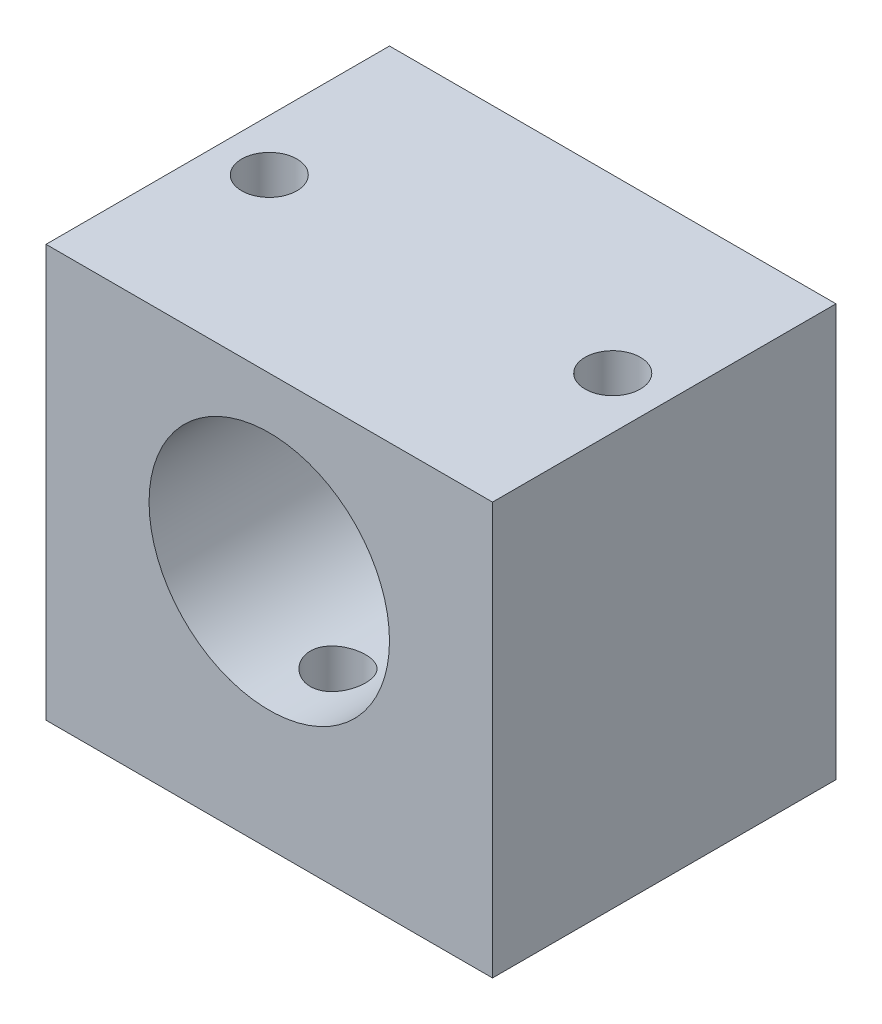
ISO-10303-21;
HEADER;
FILE_DESCRIPTION(('STEP AP214'),'2;1');
FILE_NAME('part.step','',(''),(''),'','','');
FILE_SCHEMA(('AUTOMOTIVE_DESIGN { 1 0 10303 214 1 1 1 1 }'));
ENDSEC;
DATA;
#1=APPLICATION_CONTEXT('core data for automotive mechanical design processes');
#2=APPLICATION_PROTOCOL_DEFINITION('international standard','automotive_design',2000,#1);
#3=PRODUCT_CONTEXT('',#1,'mechanical');
#4=PRODUCT('Part','Part','',(#3));
#5=PRODUCT_RELATED_PRODUCT_CATEGORY('part','',(#4));
#6=PRODUCT_DEFINITION_FORMATION('','',#4);
#7=PRODUCT_DEFINITION_CONTEXT('part definition',#1,'design');
#8=PRODUCT_DEFINITION('design','',#6,#7);
#9=PRODUCT_DEFINITION_SHAPE('','',#8);
#10=(LENGTH_UNIT() NAMED_UNIT(*) SI_UNIT(.MILLI.,.METRE.));
#11=(NAMED_UNIT(*) PLANE_ANGLE_UNIT() SI_UNIT($,.RADIAN.));
#12=(NAMED_UNIT(*) SI_UNIT($,.STERADIAN.) SOLID_ANGLE_UNIT());
#13=UNCERTAINTY_MEASURE_WITH_UNIT(LENGTH_MEASURE(1.E-05),#10,'distance_accuracy_value','');
#14=(GEOMETRIC_REPRESENTATION_CONTEXT(3) GLOBAL_UNCERTAINTY_ASSIGNED_CONTEXT((#13)) GLOBAL_UNIT_ASSIGNED_CONTEXT((#10,
#11,#12)) REPRESENTATION_CONTEXT('',''));
#15=CARTESIAN_POINT('',(0.,0.,0.));
#16=DIRECTION('',(0.,0.,1.));
#17=DIRECTION('',(1.,0.,0.));
#18=AXIS2_PLACEMENT_3D('',#15,#16,#17);
#19=CARTESIAN_POINT('',(20.6375,19.05,-15.875));
#20=DIRECTION('',(0.,0.,1.));
#21=DIRECTION('',(0.,-1.,0.));
#22=AXIS2_PLACEMENT_3D('',#19,#20,#21);
#23=PLANE('',#22);
#24=CARTESIAN_POINT('',(0.,3.175,-15.875));
#25=DIRECTION('',(0.,0.,1.));
#26=DIRECTION('',(0.,-1.,0.));
#27=AXIS2_PLACEMENT_3D('',#24,#25,#26);
#28=CIRCLE('',#27,11.1125);
#29=CARTESIAN_POINT('',(0.,-7.93750000000001,-15.875));
#30=VERTEX_POINT('',#29);
#31=EDGE_CURVE('E105',#30,#30,#28,.T.);
#32=ORIENTED_EDGE('',*,*,#31,.T.);
#33=EDGE_LOOP('',(#32));
#34=FACE_BOUND('',#33,.T.);
#35=DIRECTION('',(0.,1.,0.));
#36=VECTOR('',#35,1.);
#37=CARTESIAN_POINT('',(-20.6375,19.05,-15.875));
#38=LINE('',#37,#36);
#39=CARTESIAN_POINT('',(-20.6375,-19.05,-15.875));
#40=VERTEX_POINT('',#39);
#41=CARTESIAN_POINT('',(-20.6375,19.05,-15.875));
#42=VERTEX_POINT('',#41);
#43=EDGE_CURVE('E102',#40,#42,#38,.T.);
#44=ORIENTED_EDGE('',*,*,#43,.T.);
#45=DIRECTION('',(-1.,0.,0.));
#46=VECTOR('',#45,1.);
#47=CARTESIAN_POINT('',(20.6375,19.05,-15.875));
#48=LINE('',#47,#46);
#49=CARTESIAN_POINT('',(20.6375,19.05,-15.875));
#50=VERTEX_POINT('',#49);
#51=EDGE_CURVE('E11',#50,#42,#48,.T.);
#52=ORIENTED_EDGE('',*,*,#51,.F.);
#53=DIRECTION('',(0.,1.,0.));
#54=VECTOR('',#53,1.);
#55=CARTESIAN_POINT('',(20.6375,19.05,-15.875));
#56=LINE('',#55,#54);
#57=CARTESIAN_POINT('',(20.6375,-19.05,-15.875));
#58=VERTEX_POINT('',#57);
#59=EDGE_CURVE('E90',#58,#50,#56,.T.);
#60=ORIENTED_EDGE('',*,*,#59,.F.);
#61=DIRECTION('',(-1.,0.,0.));
#62=VECTOR('',#61,1.);
#63=CARTESIAN_POINT('',(20.6375,-19.05,-15.875));
#64=LINE('',#63,#62);
#65=EDGE_CURVE('E98',#58,#40,#64,.T.);
#66=ORIENTED_EDGE('',*,*,#65,.T.);
#67=EDGE_LOOP('',(#44,#52,#60,#66));
#68=FACE_BOUND('',#67,.T.);
#69=ADVANCED_FACE('F39',(#34,#68),#23,.F.);
#70=CARTESIAN_POINT('',(20.6375,19.05,15.875));
#71=DIRECTION('',(0.,-1.,0.));
#72=DIRECTION('',(0.,0.,-1.));
#73=AXIS2_PLACEMENT_3D('',#70,#71,#72);
#74=PLANE('',#73);
#75=CARTESIAN_POINT('',(-15.875,19.05,0.));
#76=DIRECTION('',(0.,1.,0.));
#77=DIRECTION('',(0.,0.,1.));
#78=AXIS2_PLACEMENT_3D('',#75,#76,#77);
#79=CIRCLE('',#78,2.55269999999999);
#80=CARTESIAN_POINT('',(-15.875,19.05,2.55269999999999));
#81=VERTEX_POINT('',#80);
#82=EDGE_CURVE('E130',#81,#81,#79,.T.);
#83=ORIENTED_EDGE('',*,*,#82,.F.);
#84=EDGE_LOOP('',(#83));
#85=FACE_BOUND('',#84,.T.);
#86=CARTESIAN_POINT('',(15.875,19.05,0.));
#87=DIRECTION('',(0.,1.,0.));
#88=DIRECTION('',(0.,0.,1.));
#89=AXIS2_PLACEMENT_3D('',#86,#87,#88);
#90=CIRCLE('',#89,2.55269999999999);
#91=CARTESIAN_POINT('',(15.875,19.05,2.55269999999999));
#92=VERTEX_POINT('',#91);
#93=EDGE_CURVE('E124',#92,#92,#90,.T.);
#94=ORIENTED_EDGE('',*,*,#93,.F.);
#95=EDGE_LOOP('',(#94));
#96=FACE_BOUND('',#95,.T.);
#97=DIRECTION('',(0.,0.,1.));
#98=VECTOR('',#97,1.);
#99=CARTESIAN_POINT('',(-20.6375,19.05,15.875));
#100=LINE('',#99,#98);
#101=CARTESIAN_POINT('',(-20.6375,19.05,15.875));
#102=VERTEX_POINT('',#101);
#103=EDGE_CURVE('E94',#42,#102,#100,.T.);
#104=ORIENTED_EDGE('',*,*,#103,.T.);
#105=DIRECTION('',(-1.,0.,0.));
#106=VECTOR('',#105,1.);
#107=CARTESIAN_POINT('',(20.6375,19.05,15.875));
#108=LINE('',#107,#106);
#109=CARTESIAN_POINT('',(20.6375,19.05,15.875));
#110=VERTEX_POINT('',#109);
#111=EDGE_CURVE('E47',#110,#102,#108,.T.);
#112=ORIENTED_EDGE('',*,*,#111,.F.);
#113=DIRECTION('',(0.,0.,1.));
#114=VECTOR('',#113,1.);
#115=CARTESIAN_POINT('',(20.6375,19.05,15.875));
#116=LINE('',#115,#114);
#117=EDGE_CURVE('E85',#50,#110,#116,.T.);
#118=ORIENTED_EDGE('',*,*,#117,.F.);
#119=ORIENTED_EDGE('',*,*,#51,.T.);
#120=EDGE_LOOP('',(#104,#112,#118,#119));
#121=FACE_BOUND('',#120,.T.);
#122=ADVANCED_FACE('F93',(#85,#96,#121),#74,.F.);
#123=CARTESIAN_POINT('',(20.6375,19.05,15.875));
#124=DIRECTION('',(0.,0.,-1.));
#125=DIRECTION('',(0.,1.,0.));
#126=AXIS2_PLACEMENT_3D('',#123,#124,#125);
#127=PLANE('',#126);
#128=CARTESIAN_POINT('',(0.,3.175,15.875));
#129=DIRECTION('',(0.,0.,1.));
#130=DIRECTION('',(1.,0.,0.));
#131=AXIS2_PLACEMENT_3D('',#128,#129,#130);
#132=CIRCLE('',#131,11.1125);
#133=CARTESIAN_POINT('',(11.1125,3.175,15.875));
#134=VERTEX_POINT('',#133);
#135=EDGE_CURVE('E118',#134,#134,#132,.T.);
#136=ORIENTED_EDGE('',*,*,#135,.F.);
#137=EDGE_LOOP('',(#136));
#138=FACE_BOUND('',#137,.T.);
#139=DIRECTION('',(0.,-1.,0.));
#140=VECTOR('',#139,1.);
#141=CARTESIAN_POINT('',(-20.6375,19.05,15.875));
#142=LINE('',#141,#140);
#143=CARTESIAN_POINT('',(-20.6375,-19.05,15.875));
#144=VERTEX_POINT('',#143);
#145=EDGE_CURVE('E72',#102,#144,#142,.T.);
#146=ORIENTED_EDGE('',*,*,#145,.T.);
#147=DIRECTION('',(-1.,0.,0.));
#148=VECTOR('',#147,1.);
#149=CARTESIAN_POINT('',(20.6375,-19.05,15.875));
#150=LINE('',#149,#148);
#151=CARTESIAN_POINT('',(20.6375,-19.05,15.875));
#152=VERTEX_POINT('',#151);
#153=EDGE_CURVE('E95',#152,#144,#150,.T.);
#154=ORIENTED_EDGE('',*,*,#153,.F.);
#155=DIRECTION('',(0.,-1.,0.));
#156=VECTOR('',#155,1.);
#157=CARTESIAN_POINT('',(20.6375,19.05,15.875));
#158=LINE('',#157,#156);
#159=EDGE_CURVE('E88',#110,#152,#158,.T.);
#160=ORIENTED_EDGE('',*,*,#159,.F.);
#161=ORIENTED_EDGE('',*,*,#111,.T.);
#162=EDGE_LOOP('',(#146,#154,#160,#161));
#163=FACE_BOUND('',#162,.T.);
#164=ADVANCED_FACE('F96',(#138,#163),#127,.F.);
#165=CARTESIAN_POINT('',(20.6375,-19.05,15.875));
#166=DIRECTION('',(0.,1.,0.));
#167=DIRECTION('',(0.,0.,1.));
#168=AXIS2_PLACEMENT_3D('',#165,#166,#167);
#169=PLANE('',#168);
#170=CARTESIAN_POINT('',(0.,-19.05,-9.525));
#171=DIRECTION('',(0.,-1.,0.));
#172=DIRECTION('',(0.,0.,-1.));
#173=AXIS2_PLACEMENT_3D('',#170,#171,#172);
#174=CIRCLE('',#173,2.55269999999999);
#175=CARTESIAN_POINT('',(0.,-19.05,-12.0777));
#176=VERTEX_POINT('',#175);
#177=EDGE_CURVE('E159',#176,#176,#174,.T.);
#178=ORIENTED_EDGE('',*,*,#177,.F.);
#179=EDGE_LOOP('',(#178));
#180=FACE_BOUND('',#179,.T.);
#181=CARTESIAN_POINT('',(0.,-19.05,9.525));
#182=DIRECTION('',(0.,-1.,0.));
#183=DIRECTION('',(0.,0.,-1.));
#184=AXIS2_PLACEMENT_3D('',#181,#182,#183);
#185=CIRCLE('',#184,2.55269999999999);
#186=CARTESIAN_POINT('',(0.,-19.05,6.97230000000001));
#187=VERTEX_POINT('',#186);
#188=EDGE_CURVE('E140',#187,#187,#185,.T.);
#189=ORIENTED_EDGE('',*,*,#188,.F.);
#190=EDGE_LOOP('',(#189));
#191=FACE_BOUND('',#190,.T.);
#192=CARTESIAN_POINT('',(-15.875,-19.05,0.));
#193=DIRECTION('',(0.,1.,0.));
#194=DIRECTION('',(0.,0.,1.));
#195=AXIS2_PLACEMENT_3D('',#192,#193,#194);
#196=CIRCLE('',#195,2.55269999999999);
#197=CARTESIAN_POINT('',(-15.875,-19.05,2.55269999999999));
#198=VERTEX_POINT('',#197);
#199=EDGE_CURVE('E127',#198,#198,#196,.T.);
#200=ORIENTED_EDGE('',*,*,#199,.T.);
#201=EDGE_LOOP('',(#200));
#202=FACE_BOUND('',#201,.T.);
#203=CARTESIAN_POINT('',(15.875,-19.05,0.));
#204=DIRECTION('',(0.,1.,0.));
#205=DIRECTION('',(0.,0.,1.));
#206=AXIS2_PLACEMENT_3D('',#203,#204,#205);
#207=CIRCLE('',#206,2.55269999999999);
#208=CARTESIAN_POINT('',(15.875,-19.05,2.55269999999999));
#209=VERTEX_POINT('',#208);
#210=EDGE_CURVE('E121',#209,#209,#207,.T.);
#211=ORIENTED_EDGE('',*,*,#210,.T.);
#212=EDGE_LOOP('',(#211));
#213=FACE_BOUND('',#212,.T.);
#214=DIRECTION('',(0.,0.,-1.));
#215=VECTOR('',#214,1.);
#216=CARTESIAN_POINT('',(-20.6375,-19.05,15.875));
#217=LINE('',#216,#215);
#218=EDGE_CURVE('E78',#144,#40,#217,.T.);
#219=ORIENTED_EDGE('',*,*,#218,.T.);
#220=ORIENTED_EDGE('',*,*,#65,.F.);
#221=DIRECTION('',(0.,0.,-1.));
#222=VECTOR('',#221,1.);
#223=CARTESIAN_POINT('',(20.6375,-19.05,15.875));
#224=LINE('',#223,#222);
#225=EDGE_CURVE('E55',#152,#58,#224,.T.);
#226=ORIENTED_EDGE('',*,*,#225,.F.);
#227=ORIENTED_EDGE('',*,*,#153,.T.);
#228=EDGE_LOOP('',(#219,#220,#226,#227));
#229=FACE_BOUND('',#228,.T.);
#230=ADVANCED_FACE('F110',(#180,#191,#202,#213,#229),#169,.F.);
#231=CARTESIAN_POINT('',(20.6375,0.,0.));
#232=DIRECTION('',(1.,0.,0.));
#233=DIRECTION('',(0.,0.,-1.));
#234=AXIS2_PLACEMENT_3D('',#231,#232,#233);
#235=PLANE('',#234);
#236=ORIENTED_EDGE('',*,*,#59,.T.);
#237=ORIENTED_EDGE('',*,*,#117,.T.);
#238=ORIENTED_EDGE('',*,*,#159,.T.);
#239=ORIENTED_EDGE('',*,*,#225,.T.);
#240=EDGE_LOOP('',(#236,#237,#238,#239));
#241=FACE_BOUND('',#240,.T.);
#242=ADVANCED_FACE('F86',(#241),#235,.T.);
#243=CARTESIAN_POINT('',(-20.6375,0.,0.));
#244=DIRECTION('',(1.,0.,0.));
#245=DIRECTION('',(0.,0.,-1.));
#246=AXIS2_PLACEMENT_3D('',#243,#244,#245);
#247=PLANE('',#246);
#248=ORIENTED_EDGE('',*,*,#43,.F.);
#249=ORIENTED_EDGE('',*,*,#218,.F.);
#250=ORIENTED_EDGE('',*,*,#145,.F.);
#251=ORIENTED_EDGE('',*,*,#103,.F.);
#252=EDGE_LOOP('',(#248,#249,#250,#251));
#253=FACE_BOUND('',#252,.T.);
#254=ADVANCED_FACE('F113',(#253),#247,.F.);
#255=CARTESIAN_POINT('',(0.,3.175,15.875));
#256=DIRECTION('',(0.,0.,1.));
#257=DIRECTION('',(1.,0.,0.));
#258=AXIS2_PLACEMENT_3D('',#255,#256,#257);
#259=CYLINDRICAL_SURFACE('',#258,11.1125);
#260=CARTESIAN_POINT('',(0.,-7.93750000000001,-12.0777));
#261=CARTESIAN_POINT('',(0.141396983886955,-7.93749743320184,-12.0776954360918));
#262=CARTESIAN_POINT('',(0.282847633119295,-7.9347740216355,-12.0659121621128));
#263=CARTESIAN_POINT('',(0.561718841900641,-7.92417310615283,-12.019146592161));
#264=CARTESIAN_POINT('',(0.699136659452618,-7.91629217666008,-11.984148877158));
#265=CARTESIAN_POINT('',(0.96587271229573,-7.8962520995187,-11.8921181046459));
#266=CARTESIAN_POINT('',(1.0951996598049,-7.88409765034339,-11.8351092403212));
#267=CARTESIAN_POINT('',(1.34245067648933,-7.85681645112714,-11.700754110019));
#268=CARTESIAN_POINT('',(1.460374806725,-7.84168971700367,-11.6234079529529));
#269=CARTESIAN_POINT('',(1.68355013345253,-7.80981851811462,-11.4491347758607));
#270=CARTESIAN_POINT('',(1.7885720521409,-7.79305229677804,-11.3519180978161));
#271=CARTESIAN_POINT('',(1.98097209612806,-7.75994206303306,-11.1412847824627));
#272=CARTESIAN_POINT('',(2.0683485152753,-7.74359809158531,-11.0278665804296));
#273=CARTESIAN_POINT('',(2.22401124092946,-7.71296684205349,-10.7863258611708));
#274=CARTESIAN_POINT('',(2.29204929168296,-7.69870736039382,-10.6580395119252));
#275=CARTESIAN_POINT('',(2.40551015870537,-7.6741736694577,-10.3914715212997));
#276=CARTESIAN_POINT('',(2.45093598072594,-7.66389893054571,-10.2531912111765));
#277=CARTESIAN_POINT('',(2.51711689808376,-7.6487203833916,-9.97305957814027));
#278=CARTESIAN_POINT('',(2.53828011863611,-7.64372783682415,-9.83130958854287));
#279=CARTESIAN_POINT('',(2.55660488622196,-7.6394127531456,-9.54618995160225));
#280=CARTESIAN_POINT('',(2.55376970010109,-7.64008944429461,-9.40282052736226));
#281=CARTESIAN_POINT('',(2.52450561772005,-7.64695622742298,-9.12159688432568));
#282=CARTESIAN_POINT('',(2.49855486877438,-7.65303457969067,-8.98368976352221));
#283=CARTESIAN_POINT('',(2.42455559340401,-7.66984267309241,-8.71424051281405));
#284=CARTESIAN_POINT('',(2.37650571343134,-7.68057269913417,-8.58269877332761));
#285=CARTESIAN_POINT('',(2.25924386489668,-7.70558268281674,-8.32839110194258));
#286=CARTESIAN_POINT('',(2.18985154863029,-7.7198926919292,-8.20571140761475));
#287=CARTESIAN_POINT('',(2.03200118441898,-7.7504323400943,-7.97356243646483));
#288=CARTESIAN_POINT('',(1.94354028596764,-7.76666226598583,-7.86409513854574));
#289=CARTESIAN_POINT('',(1.74755103037358,-7.79968949137807,-7.65872962382428));
#290=CARTESIAN_POINT('',(1.63961709180029,-7.81649107479658,-7.56321874248001));
#291=CARTESIAN_POINT('',(1.4090694191414,-7.84841604655303,-7.39158654688537));
#292=CARTESIAN_POINT('',(1.28645536334506,-7.86353939809899,-7.31546565767574));
#293=CARTESIAN_POINT('',(1.02952843056192,-7.89046123674221,-7.18466309835537));
#294=CARTESIAN_POINT('',(0.895186685498858,-7.90225119827246,-7.13003626486969));
#295=CARTESIAN_POINT('',(0.618898468394042,-7.92111505852927,-7.04424273108349));
#296=CARTESIAN_POINT('',(0.476953222862738,-7.92818971541508,-7.01307225920302));
#297=CARTESIAN_POINT('',(0.19280606259815,-7.93671648014324,-6.97564909352967));
#298=CARTESIAN_POINT('',(0.050677239229148,-7.93828782865201,-6.96886786705824));
#299=CARTESIAN_POINT('',(-0.232682790362516,-7.93596691655542,-6.97897737835172));
#300=CARTESIAN_POINT('',(-0.373914063295772,-7.93207506688892,-6.9958663356578));
#301=CARTESIAN_POINT('',(-0.649689940724073,-7.91934070592156,-7.05239927732254));
#302=CARTESIAN_POINT('',(-0.784295220339053,-7.91055935695851,-7.09176228715381));
#303=CARTESIAN_POINT('',(-1.04499043452638,-7.88903068437119,-7.19181104774329));
#304=CARTESIAN_POINT('',(-1.17107959309543,-7.87628299991956,-7.25249873852557));
#305=CARTESIAN_POINT('',(-1.41332120124058,-7.84794408847207,-7.39454925415371));
#306=CARTESIAN_POINT('',(-1.52928952317552,-7.83231188178932,-7.47621771319301));
#307=CARTESIAN_POINT('',(-1.74606464066494,-7.80001465822438,-7.65751311028297));
#308=CARTESIAN_POINT('',(-1.8468692458485,-7.78334949262318,-7.75714263821622));
#309=CARTESIAN_POINT('',(-2.03257541541658,-7.75044676346517,-7.97396801793288));
#310=CARTESIAN_POINT('',(-2.11710924087232,-7.73422493400494,-8.09148168157053));
#311=CARTESIAN_POINT('',(-2.2652468924924,-7.70443220068738,-8.33934595283756));
#312=CARTESIAN_POINT('',(-2.32885164786836,-7.69086117915002,-8.46969599022198));
#313=CARTESIAN_POINT('',(-2.43287654255066,-7.66804412516852,-8.73882238643779));
#314=CARTESIAN_POINT('',(-2.47343112437019,-7.65877307232049,-8.8775445513965));
#315=CARTESIAN_POINT('',(-2.53058731275078,-7.64556655173119,-9.1600777306087));
#316=CARTESIAN_POINT('',(-2.54719320998148,-7.64163012824017,-9.30388782857179));
#317=CARTESIAN_POINT('',(-2.55578363505915,-7.63960313622686,-9.58879594876761));
#318=CARTESIAN_POINT('',(-2.54835267393321,-7.6413737834957,-9.72987566719925));
#319=CARTESIAN_POINT('',(-2.51039749828933,-7.65024518911234,-10.0087140909831));
#320=CARTESIAN_POINT('',(-2.47987361616778,-7.65734587074033,-10.1464728441074));
#321=CARTESIAN_POINT('',(-2.39689434274569,-7.67600625614539,-10.414236839253));
#322=CARTESIAN_POINT('',(-2.3445323331879,-7.68754695790856,-10.5442724331084));
#323=CARTESIAN_POINT('',(-2.219440495804,-7.71379270273672,-10.7937968791224));
#324=CARTESIAN_POINT('',(-2.14670829936039,-7.72849811374369,-10.9132845026512));
#325=CARTESIAN_POINT('',(-1.98103796124589,-7.75982458660656,-11.141183757061));
#326=CARTESIAN_POINT('',(-1.88768688334719,-7.77648094408374,-11.2492904103667));
#327=CARTESIAN_POINT('',(-1.68425493001492,-7.80960477493987,-11.4484953348679));
#328=CARTESIAN_POINT('',(-1.57417016570687,-7.82607220345289,-11.5395896414333));
#329=CARTESIAN_POINT('',(-1.33845249094085,-7.85724930683552,-11.7034692408551));
#330=CARTESIAN_POINT('',(-1.21261560861976,-7.87192972937865,-11.7759670652261));
#331=CARTESIAN_POINT('',(-0.950225185766302,-7.89758077171663,-11.898665774557));
#332=CARTESIAN_POINT('',(-0.813680303281801,-7.90855435137144,-11.9488844591734));
#333=CARTESIAN_POINT('',(-0.564265101296296,-7.92370877334189,-12.0171462223615));
#334=CARTESIAN_POINT('',(-0.452694131517628,-7.92884730157454,-12.0398086889553));
#335=CARTESIAN_POINT('',(-0.227426938195051,-7.93574385673682,-12.0700870106318));
#336=CARTESIAN_POINT('',(-0.113730828710922,-7.9375020645708,-12.0777036709203));
#337=CARTESIAN_POINT('',(0.,-7.93750000000001,-12.0777));
#338=B_SPLINE_CURVE_WITH_KNOTS('',3,(#260,#261,#262,#263,#264,#265,#266,#267,#268,#269,#270,
#271,#272,#273,#274,#275,#276,#277,#278,#279,#280,#281,#282,#283,#284,#285,#286,#287,#288,#289,
#290,#291,#292,#293,#294,#295,#296,#297,#298,#299,#300,#301,#302,#303,#304,#305,#306,#307,#308,
#309,#310,#311,#312,#313,#314,#315,#316,#317,#318,#319,#320,#321,#322,#323,#324,#325,#326,#327,
#328,#329,#330,#331,#332,#333,#334,#335,#336,#337),.UNSPECIFIED.,.T.,.F.,(4,2,2,2,2,2,2,2,2,2,2,
2,2,2,2,2,2,2,2,2,2,2,2,2,2,2,2,2,2,2,2,2,2,2,2,2,2,2,4),(0.,0.423774493378562,
0.847830739970779,1.2714222130667,1.69501141776643,2.12528317574872,2.55559651700897,
2.9912073352772,3.42676023409686,3.85487386840063,4.2829292255579,4.70233068759836,
5.12175784094856,5.54483141941705,5.9679682858267,6.40122950035738,6.83450021142712,
7.26886924458623,7.70316842003188,8.12799731890799,8.5527942640917,8.97239311136644,
9.3920301417546,9.8181659605127,10.2443632748177,10.6792840916489,11.1141855962021,
11.5465237531631,11.9787844423721,12.4006134783276,12.8224364426482,13.2424738545288,
13.6625601280782,14.0919775032117,14.521494827071,14.9572982433887,15.3927528498978,
15.7336286063473,16.0744861196662),.UNSPECIFIED.);
#339=CARTESIAN_POINT('',(0.,-7.93750000000001,-12.0777));
#340=VERTEX_POINT('',#339);
#341=EDGE_CURVE('E154',#340,#340,#338,.T.);
#342=ORIENTED_EDGE('',*,*,#341,.T.);
#343=EDGE_LOOP('',(#342));
#344=FACE_BOUND('',#343,.T.);
#345=CARTESIAN_POINT('',(0.,-7.93750000000001,6.97230000000001));
#346=CARTESIAN_POINT('',(0.141396983886955,-7.93749743320184,6.97230456390823));
#347=CARTESIAN_POINT('',(0.282847633119294,-7.9347740216355,6.98408783788718));
#348=CARTESIAN_POINT('',(0.56171884190064,-7.92417310615283,7.03085340783901));
#349=CARTESIAN_POINT('',(0.699136659452618,-7.91629217666008,7.06585112284196));
#350=CARTESIAN_POINT('',(0.96587271229573,-7.8962520995187,7.15788189535415));
#351=CARTESIAN_POINT('',(1.0951996598049,-7.88409765034339,7.21489075967883));
#352=CARTESIAN_POINT('',(1.34245067648933,-7.85681645112714,7.34924588998104));
#353=CARTESIAN_POINT('',(1.460374806725,-7.84168971700367,7.42659204704707));
#354=CARTESIAN_POINT('',(1.68355013345253,-7.80981851811462,7.60086522413929));
#355=CARTESIAN_POINT('',(1.7885720521409,-7.79305229677804,7.69808190218388));
#356=CARTESIAN_POINT('',(1.98097209612806,-7.75994206303306,7.90871521753725));
#357=CARTESIAN_POINT('',(2.0683485152753,-7.74359809158531,8.02213341957043));
#358=CARTESIAN_POINT('',(2.22401124092946,-7.71296684205349,8.26367413882919));
#359=CARTESIAN_POINT('',(2.29204929168296,-7.69870736039382,8.39196048807481));
#360=CARTESIAN_POINT('',(2.40551015870537,-7.6741736694577,8.65852847870025));
#361=CARTESIAN_POINT('',(2.45093598072594,-7.66389893054571,8.79680878882353));
#362=CARTESIAN_POINT('',(2.51711689808376,-7.6487203833916,9.07694042185973));
#363=CARTESIAN_POINT('',(2.53828011863611,-7.64372783682415,9.21869041145713));
#364=CARTESIAN_POINT('',(2.55660488622196,-7.6394127531456,9.50381004839775));
#365=CARTESIAN_POINT('',(2.55376970010109,-7.64008944429461,9.64717947263774));
#366=CARTESIAN_POINT('',(2.52450561772005,-7.64695622742298,9.92840311567432));
#367=CARTESIAN_POINT('',(2.49855486877438,-7.65303457969067,10.0663102364778));
#368=CARTESIAN_POINT('',(2.42455559340401,-7.66984267309241,10.335759487186));
#369=CARTESIAN_POINT('',(2.37650571343134,-7.68057269913417,10.4673012266724));
#370=CARTESIAN_POINT('',(2.25924386489668,-7.70558268281674,10.7216088980574));
#371=CARTESIAN_POINT('',(2.18985154863029,-7.7198926919292,10.8442885923852));
#372=CARTESIAN_POINT('',(2.03200118441898,-7.7504323400943,11.0764375635352));
#373=CARTESIAN_POINT('',(1.94354028596764,-7.76666226598583,11.1859048614543));
#374=CARTESIAN_POINT('',(1.74755103037358,-7.79968949137807,11.3912703761757));
#375=CARTESIAN_POINT('',(1.63961709180029,-7.81649107479658,11.48678125752));
#376=CARTESIAN_POINT('',(1.4090694191414,-7.84841604655303,11.6584134531146));
#377=CARTESIAN_POINT('',(1.28645536334506,-7.86353939809899,11.7345343423243));
#378=CARTESIAN_POINT('',(1.02952843056193,-7.89046123674221,11.8653369016446));
#379=CARTESIAN_POINT('',(0.89518668549886,-7.90225119827246,11.9199637351303));
#380=CARTESIAN_POINT('',(0.618898468394043,-7.92111505852927,12.0057572689165));
#381=CARTESIAN_POINT('',(0.476953222862739,-7.92818971541508,12.036927740797));
#382=CARTESIAN_POINT('',(0.192806062598151,-7.93671648014324,12.0743509064703));
#383=CARTESIAN_POINT('',(0.0506772392291486,-7.93828782865201,12.0811321329418));
#384=CARTESIAN_POINT('',(-0.232682790362516,-7.93596691655542,12.0710226216483));
#385=CARTESIAN_POINT('',(-0.373914063295772,-7.93207506688892,12.0541336643422));
#386=CARTESIAN_POINT('',(-0.649689940724073,-7.91934070592156,11.9976007226775));
#387=CARTESIAN_POINT('',(-0.784295220339053,-7.91055935695851,11.9582377128462));
#388=CARTESIAN_POINT('',(-1.04499043452638,-7.88903068437119,11.8581889522567));
#389=CARTESIAN_POINT('',(-1.17107959309543,-7.87628299991956,11.7975012614744));
#390=CARTESIAN_POINT('',(-1.41332120124058,-7.84794408847207,11.6554507458463));
#391=CARTESIAN_POINT('',(-1.52928952317552,-7.83231188178932,11.573782286807));
#392=CARTESIAN_POINT('',(-1.74606464066494,-7.80001465822438,11.392486889717));
#393=CARTESIAN_POINT('',(-1.8468692458485,-7.78334949262318,11.2928573617838));
#394=CARTESIAN_POINT('',(-2.03257541541658,-7.75044676346517,11.0760319820671));
#395=CARTESIAN_POINT('',(-2.11710924087232,-7.73422493400494,10.9585183184295));
#396=CARTESIAN_POINT('',(-2.2652468924924,-7.70443220068738,10.7106540471624));
#397=CARTESIAN_POINT('',(-2.32885164786836,-7.69086117915002,10.580304009778));
#398=CARTESIAN_POINT('',(-2.43287654255066,-7.66804412516852,10.3111776135622));
#399=CARTESIAN_POINT('',(-2.47343112437019,-7.65877307232049,10.1724554486035));
#400=CARTESIAN_POINT('',(-2.53058731275078,-7.64556655173119,9.8899222693913));
#401=CARTESIAN_POINT('',(-2.54719320998148,-7.64163012824017,9.74611217142821));
#402=CARTESIAN_POINT('',(-2.55578363505915,-7.63960313622686,9.46120405123239));
#403=CARTESIAN_POINT('',(-2.54835267393321,-7.6413737834957,9.32012433280075));
#404=CARTESIAN_POINT('',(-2.51039749828933,-7.65024518911234,9.04128590901692));
#405=CARTESIAN_POINT('',(-2.47987361616778,-7.65734587074033,8.90352715589264));
#406=CARTESIAN_POINT('',(-2.39689434274569,-7.67600625614539,8.63576316074696));
#407=CARTESIAN_POINT('',(-2.3445323331879,-7.68754695790856,8.50572756689162));
#408=CARTESIAN_POINT('',(-2.219440495804,-7.71379270273672,8.25620312087758));
#409=CARTESIAN_POINT('',(-2.14670829936039,-7.72849811374369,8.13671549734876));
#410=CARTESIAN_POINT('',(-1.98103796124589,-7.75982458660656,7.90881624293898));
#411=CARTESIAN_POINT('',(-1.88768688334719,-7.77648094408374,7.80070958963334));
#412=CARTESIAN_POINT('',(-1.68425493001492,-7.80960477493987,7.60150466513212));
#413=CARTESIAN_POINT('',(-1.57417016570687,-7.82607220345289,7.51041035856666));
#414=CARTESIAN_POINT('',(-1.33845249094085,-7.85724930683552,7.34653075914495));
#415=CARTESIAN_POINT('',(-1.21261560861976,-7.87192972937865,7.27403293477387));
#416=CARTESIAN_POINT('',(-0.950225185766303,-7.89758077171663,7.15133422544295));
#417=CARTESIAN_POINT('',(-0.813680303281802,-7.90855435137144,7.10111554082661));
#418=CARTESIAN_POINT('',(-0.564265101296296,-7.92370877334189,7.03285377763854));
#419=CARTESIAN_POINT('',(-0.452694131517628,-7.92884730157454,7.01019131104469));
#420=CARTESIAN_POINT('',(-0.227426938195051,-7.93574385673682,6.97991298936821));
#421=CARTESIAN_POINT('',(-0.113730828710922,-7.9375020645708,6.97229632907966));
#422=CARTESIAN_POINT('',(0.,-7.93750000000001,6.97230000000001));
#423=B_SPLINE_CURVE_WITH_KNOTS('',3,(#345,#346,#347,#348,#349,#350,#351,#352,#353,#354,#355,
#356,#357,#358,#359,#360,#361,#362,#363,#364,#365,#366,#367,#368,#369,#370,#371,#372,#373,#374,
#375,#376,#377,#378,#379,#380,#381,#382,#383,#384,#385,#386,#387,#388,#389,#390,#391,#392,#393,
#394,#395,#396,#397,#398,#399,#400,#401,#402,#403,#404,#405,#406,#407,#408,#409,#410,#411,#412,
#413,#414,#415,#416,#417,#418,#419,#420,#421,#422),.UNSPECIFIED.,.T.,.F.,(4,2,2,2,2,2,2,2,2,2,2,
2,2,2,2,2,2,2,2,2,2,2,2,2,2,2,2,2,2,2,2,2,2,2,2,2,2,2,4),(0.,0.423774493378562,
0.847830739970778,1.2714222130667,1.69501141776643,2.12528317574872,2.55559651700897,
2.9912073352772,3.42676023409686,3.85487386840063,4.28292922555789,4.70233068759836,
5.12175784094856,5.54483141941705,5.9679682858267,6.40122950035738,6.83450021142711,
7.26886924458622,7.70316842003187,8.12799731890799,8.55279426409169,8.97239311136643,
9.3920301417546,9.8181659605127,10.2443632748177,10.6792840916489,11.1141855962021,
11.5465237531631,11.9787844423721,12.4006134783276,12.8224364426482,13.2424738545288,
13.6625601280782,14.0919775032117,14.521494827071,14.9572982433887,15.3927528498978,
15.7336286063473,16.0744861196662),.UNSPECIFIED.);
#424=CARTESIAN_POINT('',(0.,-7.93750000000001,6.97230000000001));
#425=VERTEX_POINT('',#424);
#426=EDGE_CURVE('E133',#425,#425,#423,.T.);
#427=ORIENTED_EDGE('',*,*,#426,.T.);
#428=EDGE_LOOP('',(#427));
#429=FACE_BOUND('',#428,.T.);
#430=ORIENTED_EDGE('',*,*,#31,.F.);
#431=EDGE_LOOP('',(#430));
#432=FACE_BOUND('',#431,.T.);
#433=ORIENTED_EDGE('',*,*,#135,.T.);
#434=EDGE_LOOP('',(#433));
#435=FACE_BOUND('',#434,.T.);
#436=ADVANCED_FACE('F177',(#344,#429,#432,#435),#259,.F.);
#437=CARTESIAN_POINT('',(15.875,19.05,0.));
#438=DIRECTION('',(0.,1.,0.));
#439=DIRECTION('',(0.,0.,1.));
#440=AXIS2_PLACEMENT_3D('',#437,#438,#439);
#441=CYLINDRICAL_SURFACE('',#440,2.55269999999999);
#442=ORIENTED_EDGE('',*,*,#210,.F.);
#443=EDGE_LOOP('',(#442));
#444=FACE_BOUND('',#443,.T.);
#445=ORIENTED_EDGE('',*,*,#93,.T.);
#446=EDGE_LOOP('',(#445));
#447=FACE_BOUND('',#446,.T.);
#448=ADVANCED_FACE('F174',(#444,#447),#441,.F.);
#449=CARTESIAN_POINT('',(-15.875,19.05,0.));
#450=DIRECTION('',(0.,1.,0.));
#451=DIRECTION('',(0.,0.,1.));
#452=AXIS2_PLACEMENT_3D('',#449,#450,#451);
#453=CYLINDRICAL_SURFACE('',#452,2.55269999999999);
#454=ORIENTED_EDGE('',*,*,#199,.F.);
#455=EDGE_LOOP('',(#454));
#456=FACE_BOUND('',#455,.T.);
#457=ORIENTED_EDGE('',*,*,#82,.T.);
#458=EDGE_LOOP('',(#457));
#459=FACE_BOUND('',#458,.T.);
#460=ADVANCED_FACE('F149',(#456,#459),#453,.F.);
#461=CARTESIAN_POINT('',(0.,-19.05,9.525));
#462=DIRECTION('',(0.,-1.,0.));
#463=DIRECTION('',(0.,0.,-1.));
#464=AXIS2_PLACEMENT_3D('',#461,#462,#463);
#465=CYLINDRICAL_SURFACE('',#464,2.55269999999999);
#466=ORIENTED_EDGE('',*,*,#426,.F.);
#467=EDGE_LOOP('',(#466));
#468=FACE_BOUND('',#467,.T.);
#469=ORIENTED_EDGE('',*,*,#188,.T.);
#470=EDGE_LOOP('',(#469));
#471=FACE_BOUND('',#470,.T.);
#472=ADVANCED_FACE('F144',(#468,#471),#465,.F.);
#473=CARTESIAN_POINT('',(0.,-19.05,-9.525));
#474=DIRECTION('',(0.,-1.,0.));
#475=DIRECTION('',(0.,0.,-1.));
#476=AXIS2_PLACEMENT_3D('',#473,#474,#475);
#477=CYLINDRICAL_SURFACE('',#476,2.55269999999999);
#478=ORIENTED_EDGE('',*,*,#341,.F.);
#479=EDGE_LOOP('',(#478));
#480=FACE_BOUND('',#479,.T.);
#481=ORIENTED_EDGE('',*,*,#177,.T.);
#482=EDGE_LOOP('',(#481));
#483=FACE_BOUND('',#482,.T.);
#484=ADVANCED_FACE('F148',(#480,#483),#477,.F.);
#485=CLOSED_SHELL('',(#69,#122,#164,#230,#242,#254,#436,#448,#460,#472,#484));
#486=MANIFOLD_SOLID_BREP('B2',#485);
#487=ADVANCED_BREP_SHAPE_REPRESENTATION('',(#18,#486),#14);
#488=SHAPE_DEFINITION_REPRESENTATION(#9,#487);
ENDSEC;
END-ISO-10303-21;
